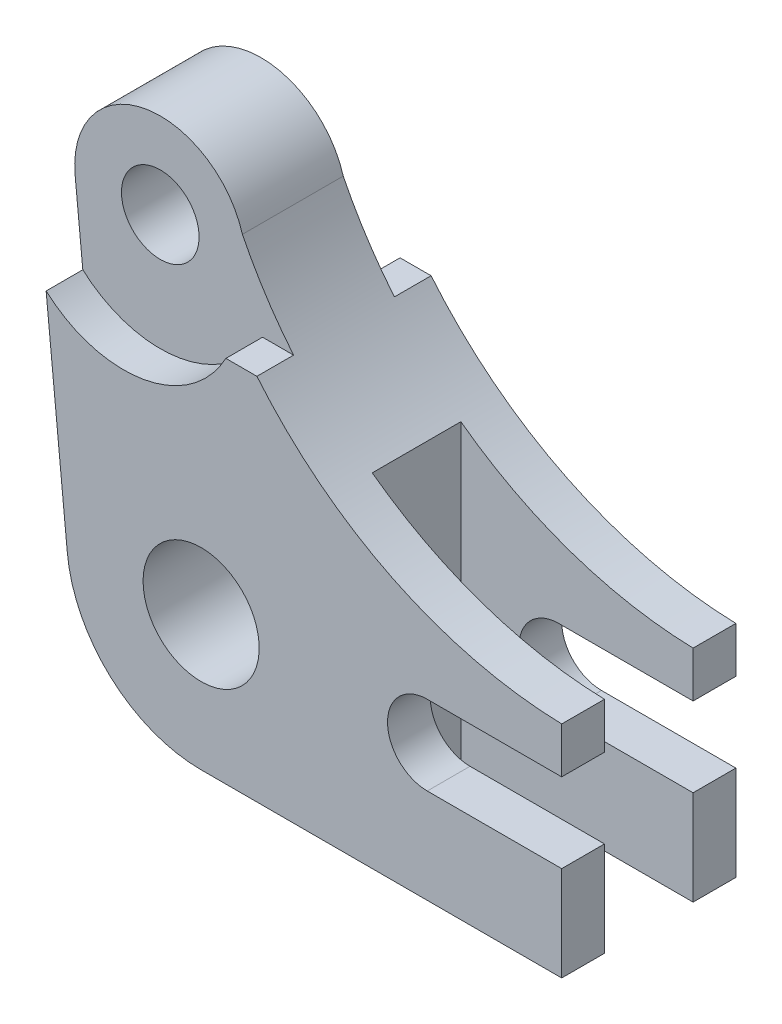
ISO-10303-21;
HEADER;
FILE_DESCRIPTION(('STEP AP214'),'2;1');
FILE_NAME('part.step','',(''),(''),'','','');
FILE_SCHEMA(('AUTOMOTIVE_DESIGN { 1 0 10303 214 1 1 1 1 }'));
ENDSEC;
DATA;
#1=APPLICATION_CONTEXT('core data for automotive mechanical design processes');
#2=APPLICATION_PROTOCOL_DEFINITION('international standard','automotive_design',2000,#1);
#3=PRODUCT_CONTEXT('',#1,'mechanical');
#4=PRODUCT('Part','Part','',(#3));
#5=PRODUCT_RELATED_PRODUCT_CATEGORY('part','',(#4));
#6=PRODUCT_DEFINITION_FORMATION('','',#4);
#7=PRODUCT_DEFINITION_CONTEXT('part definition',#1,'design');
#8=PRODUCT_DEFINITION('design','',#6,#7);
#9=PRODUCT_DEFINITION_SHAPE('','',#8);
#10=(LENGTH_UNIT() NAMED_UNIT(*) SI_UNIT(.MILLI.,.METRE.));
#11=(NAMED_UNIT(*) PLANE_ANGLE_UNIT() SI_UNIT($,.RADIAN.));
#12=(NAMED_UNIT(*) SI_UNIT($,.STERADIAN.) SOLID_ANGLE_UNIT());
#13=UNCERTAINTY_MEASURE_WITH_UNIT(LENGTH_MEASURE(1.E-05),#10,'distance_accuracy_value','');
#14=(GEOMETRIC_REPRESENTATION_CONTEXT(3) GLOBAL_UNCERTAINTY_ASSIGNED_CONTEXT((#13)) GLOBAL_UNIT_ASSIGNED_CONTEXT((#10,
#11,#12)) REPRESENTATION_CONTEXT('',''));
#15=CARTESIAN_POINT('',(0.,0.,0.));
#16=DIRECTION('',(0.,0.,1.));
#17=DIRECTION('',(1.,0.,0.));
#18=AXIS2_PLACEMENT_3D('',#15,#16,#17);
#19=CARTESIAN_POINT('',(-1.01804761617024,-59.4564208831454,28.5));
#20=DIRECTION('',(-1.,0.,0.));
#21=DIRECTION('',(0.,0.,1.));
#22=AXIS2_PLACEMENT_3D('',#19,#20,#21);
#23=PLANE('',#22);
#24=DIRECTION('',(0.,0.,-1.));
#25=VECTOR('',#24,1.);
#26=CARTESIAN_POINT('',(-1.01804761617024,-74.9564208831454,28.5));
#27=LINE('',#26,#25);
#28=CARTESIAN_POINT('',(-1.01804761617024,-74.9564208831454,28.5));
#29=VERTEX_POINT('',#28);
#30=CARTESIAN_POINT('',(-1.01804761617024,-74.9564208831454,21.5));
#31=VERTEX_POINT('',#30);
#32=EDGE_CURVE('E450',#29,#31,#27,.T.);
#33=ORIENTED_EDGE('',*,*,#32,.T.);
#34=DIRECTION('',(0.,-1.,0.));
#35=VECTOR('',#34,1.);
#36=CARTESIAN_POINT('',(-1.01804761617022,8.37394460501897,21.5));
#37=LINE('',#36,#35);
#38=CARTESIAN_POINT('',(-1.01804761617023,-59.4564208831454,21.5));
#39=VERTEX_POINT('',#38);
#40=EDGE_CURVE('E221',#39,#31,#37,.T.);
#41=ORIENTED_EDGE('',*,*,#40,.F.);
#42=DIRECTION('',(0.,0.,-1.));
#43=VECTOR('',#42,1.);
#44=CARTESIAN_POINT('',(-1.01804761617024,-59.4564208831454,28.5));
#45=LINE('',#44,#43);
#46=CARTESIAN_POINT('',(-1.01804761617024,-59.4564208831454,28.5));
#47=VERTEX_POINT('',#46);
#48=EDGE_CURVE('E445',#47,#39,#45,.T.);
#49=ORIENTED_EDGE('',*,*,#48,.F.);
#50=DIRECTION('',(0.,1.,0.));
#51=VECTOR('',#50,1.);
#52=CARTESIAN_POINT('',(-1.01804761617024,-59.4564208831454,28.5));
#53=LINE('',#52,#51);
#54=EDGE_CURVE('E357',#29,#47,#53,.T.);
#55=ORIENTED_EDGE('',*,*,#54,.F.);
#56=EDGE_LOOP('',(#33,#41,#49,#55));
#57=FACE_BOUND('',#56,.T.);
#58=ADVANCED_FACE('F44',(#57),#23,.F.);
#59=CARTESIAN_POINT('',(-23.0180476161702,-59.4564208831454,28.5));
#60=DIRECTION('',(0.,-1.,0.));
#61=DIRECTION('',(1.,0.,0.));
#62=AXIS2_PLACEMENT_3D('',#59,#60,#61);
#63=PLANE('',#62);
#64=ORIENTED_EDGE('',*,*,#48,.T.);
#65=DIRECTION('',(-1.,0.,0.));
#66=VECTOR('',#65,1.);
#67=CARTESIAN_POINT('',(-23.0180476161702,-59.4564208831454,21.5));
#68=LINE('',#67,#66);
#69=CARTESIAN_POINT('',(-23.0180476161702,-59.4564208831454,21.5));
#70=VERTEX_POINT('',#69);
#71=EDGE_CURVE('E264',#39,#70,#68,.T.);
#72=ORIENTED_EDGE('',*,*,#71,.T.);
#73=DIRECTION('',(0.,0.,-1.));
#74=VECTOR('',#73,1.);
#75=CARTESIAN_POINT('',(-23.0180476161702,-59.4564208831454,28.5));
#76=LINE('',#75,#74);
#77=CARTESIAN_POINT('',(-23.0180476161702,-59.4564208831454,28.5));
#78=VERTEX_POINT('',#77);
#79=EDGE_CURVE('E440',#78,#70,#76,.T.);
#80=ORIENTED_EDGE('',*,*,#79,.F.);
#81=DIRECTION('',(-1.,0.,0.));
#82=VECTOR('',#81,1.);
#83=CARTESIAN_POINT('',(-23.0180476161702,-59.4564208831454,28.5));
#84=LINE('',#83,#82);
#85=EDGE_CURVE('E360',#47,#78,#84,.T.);
#86=ORIENTED_EDGE('',*,*,#85,.F.);
#87=EDGE_LOOP('',(#64,#72,#80,#86));
#88=FACE_BOUND('',#87,.T.);
#89=ADVANCED_FACE('F498',(#88),#63,.F.);
#90=CARTESIAN_POINT('',(-23.0180476161702,-52.9564208831454,28.5));
#91=DIRECTION('',(0.,0.,-1.));
#92=DIRECTION('',(-1.,0.,0.));
#93=AXIS2_PLACEMENT_3D('',#90,#91,#92);
#94=CYLINDRICAL_SURFACE('',#93,6.5);
#95=ORIENTED_EDGE('',*,*,#79,.T.);
#96=CARTESIAN_POINT('',(-23.0180476161702,-52.9564208831454,21.5));
#97=DIRECTION('',(0.,0.,1.));
#98=DIRECTION('',(1.,0.,0.));
#99=AXIS2_PLACEMENT_3D('',#96,#97,#98);
#100=CIRCLE('',#99,6.5);
#101=CARTESIAN_POINT('',(-23.0180476161702,-46.4564208831454,21.5));
#102=VERTEX_POINT('',#101);
#103=EDGE_CURVE('E260',#70,#102,#100,.F.);
#104=ORIENTED_EDGE('',*,*,#103,.T.);
#105=DIRECTION('',(0.,0.,-1.));
#106=VECTOR('',#105,1.);
#107=CARTESIAN_POINT('',(-23.0180476161702,-46.4564208831454,28.5));
#108=LINE('',#107,#106);
#109=CARTESIAN_POINT('',(-23.0180476161702,-46.4564208831454,28.5));
#110=VERTEX_POINT('',#109);
#111=EDGE_CURVE('E435',#110,#102,#108,.T.);
#112=ORIENTED_EDGE('',*,*,#111,.F.);
#113=CARTESIAN_POINT('',(-23.0180476161702,-52.9564208831454,28.5));
#114=DIRECTION('',(0.,0.,-1.));
#115=DIRECTION('',(-1.,0.,0.));
#116=AXIS2_PLACEMENT_3D('',#113,#114,#115);
#117=CIRCLE('',#116,6.5);
#118=EDGE_CURVE('E363',#78,#110,#117,.T.);
#119=ORIENTED_EDGE('',*,*,#118,.F.);
#120=EDGE_LOOP('',(#95,#104,#112,#119));
#121=FACE_BOUND('',#120,.T.);
#122=ADVANCED_FACE('F496',(#121),#94,.F.);
#123=CARTESIAN_POINT('',(-1.01804761617024,-46.4564208831454,28.5));
#124=DIRECTION('',(0.,1.,0.));
#125=DIRECTION('',(-1.,0.,0.));
#126=AXIS2_PLACEMENT_3D('',#123,#124,#125);
#127=PLANE('',#126);
#128=ORIENTED_EDGE('',*,*,#111,.T.);
#129=DIRECTION('',(1.,0.,0.));
#130=VECTOR('',#129,1.);
#131=CARTESIAN_POINT('',(-1.01804761617024,-46.4564208831454,21.5));
#132=LINE('',#131,#130);
#133=CARTESIAN_POINT('',(-1.01804761617023,-46.4564208831454,21.5));
#134=VERTEX_POINT('',#133);
#135=EDGE_CURVE('E256',#102,#134,#132,.T.);
#136=ORIENTED_EDGE('',*,*,#135,.T.);
#137=DIRECTION('',(0.,0.,-1.));
#138=VECTOR('',#137,1.);
#139=CARTESIAN_POINT('',(-1.01804761617024,-46.4564208831454,28.5));
#140=LINE('',#139,#138);
#141=CARTESIAN_POINT('',(-1.01804761617024,-46.4564208831454,28.5));
#142=VERTEX_POINT('',#141);
#143=EDGE_CURVE('E430',#142,#134,#140,.T.);
#144=ORIENTED_EDGE('',*,*,#143,.F.);
#145=DIRECTION('',(1.,0.,0.));
#146=VECTOR('',#145,1.);
#147=CARTESIAN_POINT('',(-1.01804761617024,-46.4564208831454,28.5));
#148=LINE('',#147,#146);
#149=EDGE_CURVE('E366',#110,#142,#148,.T.);
#150=ORIENTED_EDGE('',*,*,#149,.F.);
#151=EDGE_LOOP('',(#128,#136,#144,#150));
#152=FACE_BOUND('',#151,.T.);
#153=ADVANCED_FACE('F482',(#152),#127,.F.);
#154=CARTESIAN_POINT('',(-1.01804761617024,-46.4564208831454,28.5));
#155=DIRECTION('',(-1.,0.,0.));
#156=DIRECTION('',(0.,0.,1.));
#157=AXIS2_PLACEMENT_3D('',#154,#155,#156);
#158=PLANE('',#157);
#159=ORIENTED_EDGE('',*,*,#143,.T.);
#160=CARTESIAN_POINT('',(-1.01804761617023,-38.9564208831453,21.5));
#161=VERTEX_POINT('',#160);
#162=EDGE_CURVE('E236',#161,#134,#37,.T.);
#163=ORIENTED_EDGE('',*,*,#162,.F.);
#164=DIRECTION('',(0.,0.,-1.));
#165=VECTOR('',#164,1.);
#166=CARTESIAN_POINT('',(-1.01804761617022,-38.9564208831454,28.5));
#167=LINE('',#166,#165);
#168=CARTESIAN_POINT('',(-1.01804761617022,-38.9564208831454,28.5));
#169=VERTEX_POINT('',#168);
#170=EDGE_CURVE('E425',#169,#161,#167,.T.);
#171=ORIENTED_EDGE('',*,*,#170,.F.);
#172=DIRECTION('',(0.,1.,0.));
#173=VECTOR('',#172,1.);
#174=CARTESIAN_POINT('',(-1.01804761617024,-46.4564208831454,28.5));
#175=LINE('',#174,#173);
#176=EDGE_CURVE('E369',#142,#169,#175,.T.);
#177=ORIENTED_EDGE('',*,*,#176,.F.);
#178=EDGE_LOOP('',(#159,#163,#171,#177));
#179=FACE_BOUND('',#178,.T.);
#180=ADVANCED_FACE('F486',(#179),#158,.F.);
#181=CARTESIAN_POINT('',(-72.7001808261938,-5.62605539498104,28.5));
#182=DIRECTION('',(0.,0.,-1.));
#183=DIRECTION('',(-1.,0.,0.));
#184=AXIS2_PLACEMENT_3D('',#181,#182,#183);
#185=CYLINDRICAL_SURFACE('',#184,14.);
#186=CARTESIAN_POINT('',(-72.7001808261938,-5.62605539498104,6.));
#187=DIRECTION('',(0.,0.,-1.));
#188=DIRECTION('',(-1.,0.,0.));
#189=AXIS2_PLACEMENT_3D('',#186,#187,#188);
#190=CIRCLE('',#189,14.);
#191=CARTESIAN_POINT('',(-86.6332804061776,-6.99307262027707,6.));
#192=VERTEX_POINT('',#191);
#193=CARTESIAN_POINT('',(-59.2631461078246,-1.69590298351638,6.));
#194=VERTEX_POINT('',#193);
#195=EDGE_CURVE('E282',#192,#194,#190,.T.);
#196=ORIENTED_EDGE('',*,*,#195,.F.);
#197=DIRECTION('',(0.,0.,-1.));
#198=VECTOR('',#197,1.);
#199=CARTESIAN_POINT('',(-86.6332804061776,-6.99307262027707,28.5));
#200=LINE('',#199,#198);
#201=CARTESIAN_POINT('',(-86.6332804061776,-6.99307262027707,22.5));
#202=VERTEX_POINT('',#201);
#203=EDGE_CURVE('E416',#202,#192,#200,.T.);
#204=ORIENTED_EDGE('',*,*,#203,.F.);
#205=CARTESIAN_POINT('',(-72.7001808261938,-5.62605539498104,22.5));
#206=DIRECTION('',(0.,0.,1.));
#207=DIRECTION('',(1.,0.,0.));
#208=AXIS2_PLACEMENT_3D('',#205,#206,#207);
#209=CIRCLE('',#208,14.);
#210=CARTESIAN_POINT('',(-59.2631461078246,-1.69590298351636,22.5));
#211=VERTEX_POINT('',#210);
#212=EDGE_CURVE('E308',#211,#202,#209,.T.);
#213=ORIENTED_EDGE('',*,*,#212,.F.);
#214=DIRECTION('',(0.,0.,-1.));
#215=VECTOR('',#214,1.);
#216=CARTESIAN_POINT('',(-59.2631461078246,-1.69590298351636,28.5));
#217=LINE('',#216,#215);
#218=EDGE_CURVE('E420',#211,#194,#217,.T.);
#219=ORIENTED_EDGE('',*,*,#218,.T.);
#220=EDGE_LOOP('',(#196,#204,#213,#219));
#221=FACE_BOUND('',#220,.T.);
#222=ADVANCED_FACE('F537',(#221),#185,.T.);
#223=CARTESIAN_POINT('',(-72.700180587229,-5.62605533095061,28.5));
#224=DIRECTION('',(0.,0.,-1.));
#225=DIRECTION('',(-1.,0.,0.));
#226=AXIS2_PLACEMENT_3D('',#223,#224,#225);
#227=CYLINDRICAL_SURFACE('',#226,6.34999999998991);
#228=CARTESIAN_POINT('',(-72.700180587229,-5.62605533095061,22.5));
#229=DIRECTION('',(0.,0.,1.));
#230=DIRECTION('',(1.,0.,0.));
#231=AXIS2_PLACEMENT_3D('',#228,#229,#230);
#232=CIRCLE('',#231,6.34999999998991);
#233=CARTESIAN_POINT('',(-79.0501805872189,-5.62605533095061,22.5));
#234=VERTEX_POINT('',#233);
#235=EDGE_CURVE('E334',#234,#234,#232,.T.);
#236=CARTESIAN_POINT('',(-72.700180587229,-5.62605533095061,6.));
#237=DIRECTION('',(0.,0.,-1.));
#238=DIRECTION('',(-1.,0.,0.));
#239=AXIS2_PLACEMENT_3D('',#236,#237,#238);
#240=CIRCLE('',#239,6.34999999998991);
#241=CARTESIAN_POINT('',(-79.0501805872189,-5.62605533095061,6.00000000000001));
#242=VERTEX_POINT('',#241);
#243=EDGE_CURVE('E295',#242,#242,#240,.T.);
#244=CARTESIAN_POINT('',(-79.0501805872189,-5.62605533095061,22.5));
#245=CARTESIAN_POINT('',(-79.0501805872189,-5.62605533095061,22.328125));
#246=CARTESIAN_POINT('',(-79.0501805872189,-5.62605533095061,22.15625));
#247=CARTESIAN_POINT('',(-79.0501805872189,-5.62605533095061,21.8125));
#248=CARTESIAN_POINT('',(-79.0501805872189,-5.62605533095061,21.640625));
#249=CARTESIAN_POINT('',(-79.0501805872189,-5.62605533095061,21.296875));
#250=CARTESIAN_POINT('',(-79.0501805872189,-5.62605533095061,21.125));
#251=CARTESIAN_POINT('',(-79.0501805872189,-5.62605533095061,20.78125));
#252=CARTESIAN_POINT('',(-79.0501805872189,-5.62605533095061,20.609375));
#253=CARTESIAN_POINT('',(-79.0501805872189,-5.62605533095061,20.265625));
#254=CARTESIAN_POINT('',(-79.0501805872189,-5.62605533095061,20.09375));
#255=CARTESIAN_POINT('',(-79.0501805872189,-5.62605533095061,19.75));
#256=CARTESIAN_POINT('',(-79.0501805872189,-5.62605533095061,19.578125));
#257=CARTESIAN_POINT('',(-79.0501805872189,-5.62605533095061,19.234375));
#258=CARTESIAN_POINT('',(-79.0501805872189,-5.62605533095061,19.0625));
#259=CARTESIAN_POINT('',(-79.0501805872189,-5.62605533095061,18.71875));
#260=CARTESIAN_POINT('',(-79.0501805872189,-5.62605533095061,18.546875));
#261=CARTESIAN_POINT('',(-79.0501805872189,-5.62605533095061,18.203125));
#262=CARTESIAN_POINT('',(-79.0501805872189,-5.62605533095061,18.03125));
#263=CARTESIAN_POINT('',(-79.0501805872189,-5.62605533095061,17.6875));
#264=CARTESIAN_POINT('',(-79.0501805872189,-5.62605533095061,17.515625));
#265=CARTESIAN_POINT('',(-79.0501805872189,-5.62605533095061,17.171875));
#266=CARTESIAN_POINT('',(-79.0501805872189,-5.62605533095061,17.));
#267=CARTESIAN_POINT('',(-79.0501805872189,-5.62605533095061,16.65625));
#268=CARTESIAN_POINT('',(-79.0501805872189,-5.62605533095061,16.484375));
#269=CARTESIAN_POINT('',(-79.0501805872189,-5.62605533095061,16.140625));
#270=CARTESIAN_POINT('',(-79.0501805872189,-5.62605533095061,15.96875));
#271=CARTESIAN_POINT('',(-79.0501805872189,-5.62605533095061,15.625));
#272=CARTESIAN_POINT('',(-79.0501805872189,-5.62605533095061,15.453125));
#273=CARTESIAN_POINT('',(-79.0501805872189,-5.62605533095061,15.109375));
#274=CARTESIAN_POINT('',(-79.0501805872189,-5.62605533095061,14.9375));
#275=CARTESIAN_POINT('',(-79.0501805872189,-5.62605533095061,14.59375));
#276=CARTESIAN_POINT('',(-79.0501805872189,-5.62605533095061,14.421875));
#277=CARTESIAN_POINT('',(-79.0501805872189,-5.62605533095061,14.078125));
#278=CARTESIAN_POINT('',(-79.0501805872189,-5.62605533095061,13.90625));
#279=CARTESIAN_POINT('',(-79.0501805872189,-5.62605533095061,13.5625));
#280=CARTESIAN_POINT('',(-79.0501805872189,-5.62605533095061,13.390625));
#281=CARTESIAN_POINT('',(-79.0501805872189,-5.62605533095061,13.046875));
#282=CARTESIAN_POINT('',(-79.0501805872189,-5.62605533095061,12.875));
#283=CARTESIAN_POINT('',(-79.0501805872189,-5.62605533095061,12.53125));
#284=CARTESIAN_POINT('',(-79.0501805872189,-5.62605533095061,12.359375));
#285=CARTESIAN_POINT('',(-79.0501805872189,-5.62605533095061,12.015625));
#286=CARTESIAN_POINT('',(-79.0501805872189,-5.62605533095061,11.84375));
#287=CARTESIAN_POINT('',(-79.0501805872189,-5.62605533095061,11.5));
#288=CARTESIAN_POINT('',(-79.0501805872189,-5.62605533095061,11.328125));
#289=CARTESIAN_POINT('',(-79.0501805872189,-5.62605533095061,10.984375));
#290=CARTESIAN_POINT('',(-79.0501805872189,-5.62605533095061,10.8125));
#291=CARTESIAN_POINT('',(-79.0501805872189,-5.62605533095061,10.46875));
#292=CARTESIAN_POINT('',(-79.0501805872189,-5.62605533095061,10.296875));
#293=CARTESIAN_POINT('',(-79.0501805872189,-5.62605533095061,9.953125));
#294=CARTESIAN_POINT('',(-79.0501805872189,-5.62605533095061,9.78125));
#295=CARTESIAN_POINT('',(-79.0501805872189,-5.62605533095061,9.4375));
#296=CARTESIAN_POINT('',(-79.0501805872189,-5.62605533095061,9.26562500000001));
#297=CARTESIAN_POINT('',(-79.0501805872189,-5.62605533095061,8.92187500000001));
#298=CARTESIAN_POINT('',(-79.0501805872189,-5.62605533095061,8.75000000000001));
#299=CARTESIAN_POINT('',(-79.0501805872189,-5.62605533095061,8.40625000000001));
#300=CARTESIAN_POINT('',(-79.0501805872189,-5.62605533095061,8.234375));
#301=CARTESIAN_POINT('',(-79.0501805872189,-5.62605533095061,7.890625));
#302=CARTESIAN_POINT('',(-79.0501805872189,-5.62605533095061,7.71875));
#303=CARTESIAN_POINT('',(-79.0501805872189,-5.62605533095061,7.375));
#304=CARTESIAN_POINT('',(-79.0501805872189,-5.62605533095061,7.203125));
#305=CARTESIAN_POINT('',(-79.0501805872189,-5.62605533095061,6.859375));
#306=CARTESIAN_POINT('',(-79.0501805872189,-5.62605533095061,6.6875));
#307=CARTESIAN_POINT('',(-79.0501805872189,-5.62605533095061,6.34375));
#308=CARTESIAN_POINT('',(-79.0501805872189,-5.62605533095061,6.17187500000001));
#309=CARTESIAN_POINT('',(-79.0501805872189,-5.62605533095061,6.00000000000001));
#310=B_SPLINE_CURVE_WITH_KNOTS('',3,(#244,#245,#246,#247,#248,#249,#250,#251,#252,#253,#254,
#255,#256,#257,#258,#259,#260,#261,#262,#263,#264,#265,#266,#267,#268,#269,#270,#271,#272,#273,
#274,#275,#276,#277,#278,#279,#280,#281,#282,#283,#284,#285,#286,#287,#288,#289,#290,#291,#292,
#293,#294,#295,#296,#297,#298,#299,#300,#301,#302,#303,#304,#305,#306,#307,#308,#309),
.UNSPECIFIED.,.F.,.F.,(4,2,2,2,2,2,2,2,2,2,2,2,2,2,2,2,2,2,2,2,2,2,2,2,2,2,2,2,2,2,2,2,4),(0.,
0.515624999999999,1.03125,1.546875,2.0625,2.578125,3.09375,3.60937499999999,4.125,4.640625,
5.15625,5.671875,6.18749999999999,6.70312499999999,7.21875,7.734375,8.24999999999999,8.765625,
9.28124999999999,9.79687499999999,10.3125,10.828125,11.34375,11.859375,12.375,12.890625,
13.40625,13.921875,14.4375,14.953125,15.46875,15.984375,16.5),.UNSPECIFIED.);
#311=EDGE_CURVE('BSEAM604',#234,#242,#310,.T.);
#312=ORIENTED_EDGE('',*,*,#235,.T.);
#313=ORIENTED_EDGE('',*,*,#243,.T.);
#314=ORIENTED_EDGE('',*,*,#311,.T.);
#315=ORIENTED_EDGE('',*,*,#311,.F.);
#316=EDGE_LOOP('',(#312,#314,#313,#315));
#317=FACE_BOUND('',#316,.T.);
#318=ADVANCED_FACE('F604',(#317),#227,.F.);
#319=CARTESIAN_POINT('',(-60.0180476161702,-52.9564208831454,28.5));
#320=DIRECTION('',(0.,0.,1.));
#321=DIRECTION('',(1.,0.,0.));
#322=AXIS2_PLACEMENT_3D('',#319,#320,#321);
#323=PLANE('',#322);
#324=DIRECTION('',(1.,0.,0.));
#325=VECTOR('',#324,1.);
#326=CARTESIAN_POINT('',(-50.8887818236801,-14.626055394981,28.5));
#327=LINE('',#326,#325);
#328=CARTESIAN_POINT('',(-55.9669802955123,-14.626055394981,28.5));
#329=VERTEX_POINT('',#328);
#330=CARTESIAN_POINT('',(-50.8887818236801,-14.626055394981,28.5));
#331=VERTEX_POINT('',#330);
#332=EDGE_CURVE('E309',#329,#331,#327,.T.);
#333=ORIENTED_EDGE('',*,*,#332,.F.);
#334=CARTESIAN_POINT('',(-72.7001808261938,-5.62605539498104,28.5));
#335=DIRECTION('',(0.,0.,1.));
#336=DIRECTION('',(-1.,0.,0.));
#337=AXIS2_PLACEMENT_3D('',#334,#335,#336);
#338=CIRCLE('',#337,19.);
#339=CARTESIAN_POINT('',(-85.3790193920369,-19.7769229521766,28.5));
#340=VERTEX_POINT('',#339);
#341=EDGE_CURVE('E304',#340,#329,#338,.T.);
#342=ORIENTED_EDGE('',*,*,#341,.F.);
#343=DIRECTION('',(0.0976440875211458,-0.995221398570269,0.));
#344=VECTOR('',#343,1.);
#345=CARTESIAN_POINT('',(-86.6332804061776,-6.99307262027707,28.5));
#346=LINE('',#345,#344);
#347=CARTESIAN_POINT('',(-81.9129183847161,-55.1045908086106,28.5));
#348=VERTEX_POINT('',#347);
#349=EDGE_CURVE('E376',#340,#348,#346,.T.);
#350=ORIENTED_EDGE('',*,*,#349,.T.);
#351=CARTESIAN_POINT('',(-60.0180476161702,-52.9564208831454,28.5));
#352=DIRECTION('',(0.,0.,1.));
#353=DIRECTION('',(1.,0.,0.));
#354=AXIS2_PLACEMENT_3D('',#351,#352,#353);
#355=CIRCLE('',#354,22.);
#356=CARTESIAN_POINT('',(-60.0180476161702,-74.9564208831454,28.5));
#357=VERTEX_POINT('',#356);
#358=EDGE_CURVE('E349',#348,#357,#355,.T.);
#359=ORIENTED_EDGE('',*,*,#358,.T.);
#360=DIRECTION('',(1.,0.,0.));
#361=VECTOR('',#360,1.);
#362=CARTESIAN_POINT('',(-1.01804761617024,-74.9564208831454,28.5));
#363=LINE('',#362,#361);
#364=EDGE_CURVE('E353',#357,#29,#363,.T.);
#365=ORIENTED_EDGE('',*,*,#364,.T.);
#366=ORIENTED_EDGE('',*,*,#54,.T.);
#367=ORIENTED_EDGE('',*,*,#85,.T.);
#368=ORIENTED_EDGE('',*,*,#118,.T.);
#369=ORIENTED_EDGE('',*,*,#149,.T.);
#370=ORIENTED_EDGE('',*,*,#176,.T.);
#371=CARTESIAN_POINT('',(0.786907620125597,28.0192622906377,28.5));
#372=DIRECTION('',(0.,0.,-1.));
#373=DIRECTION('',(-1.,0.,0.));
#374=AXIS2_PLACEMENT_3D('',#371,#372,#373);
#375=CIRCLE('',#374,67.);
#376=EDGE_CURVE('E372',#169,#331,#375,.T.);
#377=ORIENTED_EDGE('',*,*,#376,.T.);
#378=EDGE_LOOP('',(#333,#342,#350,#359,#365,#366,#367,#368,#369,#370,#377));
#379=FACE_BOUND('',#378,.T.);
#380=CARTESIAN_POINT('',(-60.0180476161702,-52.9564208831454,28.5));
#381=DIRECTION('',(0.,0.,1.));
#382=DIRECTION('',(1.,0.,0.));
#383=AXIS2_PLACEMENT_3D('',#380,#381,#382);
#384=CIRCLE('',#383,9.5);
#385=CARTESIAN_POINT('',(-69.5180476161702,-52.9564208831454,28.5));
#386=VERTEX_POINT('',#385);
#387=EDGE_CURVE('E340',#386,#386,#384,.T.);
#388=ORIENTED_EDGE('',*,*,#387,.F.);
#389=EDGE_LOOP('',(#388));
#390=FACE_BOUND('',#389,.T.);
#391=ADVANCED_FACE('F490',(#379,#390),#323,.T.);
#392=CARTESIAN_POINT('',(-60.0180476161702,-52.9564208831454,0.));
#393=DIRECTION('',(0.,0.,1.));
#394=DIRECTION('',(1.,0.,0.));
#395=AXIS2_PLACEMENT_3D('',#392,#393,#394);
#396=PLANE('',#395);
#397=DIRECTION('',(0.0976440875211458,-0.995221398570269,0.));
#398=VECTOR('',#397,1.);
#399=CARTESIAN_POINT('',(-86.6332804061776,-6.99307262027707,0.));
#400=LINE('',#399,#398);
#401=CARTESIAN_POINT('',(-85.3790193920369,-19.7769229521766,0.));
#402=VERTEX_POINT('',#401);
#403=CARTESIAN_POINT('',(-81.9129183847161,-55.1045908086106,0.));
#404=VERTEX_POINT('',#403);
#405=EDGE_CURVE('E354',#402,#404,#400,.T.);
#406=ORIENTED_EDGE('',*,*,#405,.F.);
#407=CARTESIAN_POINT('',(-72.7001808261938,-5.62605539498104,0.));
#408=DIRECTION('',(0.,0.,-1.));
#409=DIRECTION('',(-1.,0.,0.));
#410=AXIS2_PLACEMENT_3D('',#407,#408,#409);
#411=CIRCLE('',#410,19.);
#412=CARTESIAN_POINT('',(-55.9669802955123,-14.626055394981,0.));
#413=VERTEX_POINT('',#412);
#414=EDGE_CURVE('E274',#413,#402,#411,.T.);
#415=ORIENTED_EDGE('',*,*,#414,.F.);
#416=DIRECTION('',(-1.,0.,0.));
#417=VECTOR('',#416,1.);
#418=CARTESIAN_POINT('',(-50.8887818236801,-14.626055394981,0.));
#419=LINE('',#418,#417);
#420=CARTESIAN_POINT('',(-50.8887818236801,-14.626055394981,0.));
#421=VERTEX_POINT('',#420);
#422=EDGE_CURVE('E268',#421,#413,#419,.T.);
#423=ORIENTED_EDGE('',*,*,#422,.F.);
#424=CARTESIAN_POINT('',(0.786907620125597,28.0192622906377,0.));
#425=DIRECTION('',(0.,0.,-1.));
#426=DIRECTION('',(-1.,0.,0.));
#427=AXIS2_PLACEMENT_3D('',#424,#425,#426);
#428=CIRCLE('',#427,67.);
#429=CARTESIAN_POINT('',(-1.01804761617022,-38.9564208831454,0.));
#430=VERTEX_POINT('',#429);
#431=EDGE_CURVE('E407',#430,#421,#428,.T.);
#432=ORIENTED_EDGE('',*,*,#431,.F.);
#433=DIRECTION('',(0.,1.,0.));
#434=VECTOR('',#433,1.);
#435=CARTESIAN_POINT('',(-1.01804761617024,-46.4564208831454,0.));
#436=LINE('',#435,#434);
#437=CARTESIAN_POINT('',(-1.01804761617024,-46.4564208831454,0.));
#438=VERTEX_POINT('',#437);
#439=EDGE_CURVE('E403',#438,#430,#436,.T.);
#440=ORIENTED_EDGE('',*,*,#439,.F.);
#441=DIRECTION('',(1.,0.,0.));
#442=VECTOR('',#441,1.);
#443=CARTESIAN_POINT('',(-1.01804761617024,-46.4564208831454,0.));
#444=LINE('',#443,#442);
#445=CARTESIAN_POINT('',(-23.0180476161702,-46.4564208831454,0.));
#446=VERTEX_POINT('',#445);
#447=EDGE_CURVE('E399',#446,#438,#444,.T.);
#448=ORIENTED_EDGE('',*,*,#447,.F.);
#449=CARTESIAN_POINT('',(-23.0180476161702,-52.9564208831454,0.));
#450=DIRECTION('',(0.,0.,-1.));
#451=DIRECTION('',(-1.,0.,0.));
#452=AXIS2_PLACEMENT_3D('',#449,#450,#451);
#453=CIRCLE('',#452,6.5);
#454=CARTESIAN_POINT('',(-23.0180476161702,-59.4564208831454,0.));
#455=VERTEX_POINT('',#454);
#456=EDGE_CURVE('E395',#455,#446,#453,.T.);
#457=ORIENTED_EDGE('',*,*,#456,.F.);
#458=DIRECTION('',(-1.,0.,0.));
#459=VECTOR('',#458,1.);
#460=CARTESIAN_POINT('',(-23.0180476161702,-59.4564208831454,0.));
#461=LINE('',#460,#459);
#462=CARTESIAN_POINT('',(-1.01804761617024,-59.4564208831454,0.));
#463=VERTEX_POINT('',#462);
#464=EDGE_CURVE('E391',#463,#455,#461,.T.);
#465=ORIENTED_EDGE('',*,*,#464,.F.);
#466=DIRECTION('',(0.,1.,0.));
#467=VECTOR('',#466,1.);
#468=CARTESIAN_POINT('',(-1.01804761617024,-59.4564208831454,0.));
#469=LINE('',#468,#467);
#470=CARTESIAN_POINT('',(-1.01804761617024,-74.9564208831454,0.));
#471=VERTEX_POINT('',#470);
#472=EDGE_CURVE('E387',#471,#463,#469,.T.);
#473=ORIENTED_EDGE('',*,*,#472,.F.);
#474=DIRECTION('',(1.,0.,0.));
#475=VECTOR('',#474,1.);
#476=CARTESIAN_POINT('',(-1.01804761617024,-74.9564208831454,0.));
#477=LINE('',#476,#475);
#478=CARTESIAN_POINT('',(-60.0180476161702,-74.9564208831454,0.));
#479=VERTEX_POINT('',#478);
#480=EDGE_CURVE('E383',#479,#471,#477,.T.);
#481=ORIENTED_EDGE('',*,*,#480,.F.);
#482=CARTESIAN_POINT('',(-60.0180476161702,-52.9564208831454,0.));
#483=DIRECTION('',(0.,0.,1.));
#484=DIRECTION('',(1.,0.,0.));
#485=AXIS2_PLACEMENT_3D('',#482,#483,#484);
#486=CIRCLE('',#485,22.);
#487=EDGE_CURVE('E344',#404,#479,#486,.T.);
#488=ORIENTED_EDGE('',*,*,#487,.F.);
#489=EDGE_LOOP('',(#406,#415,#423,#432,#440,#448,#457,#465,#473,#481,#488));
#490=FACE_BOUND('',#489,.T.);
#491=CARTESIAN_POINT('',(-60.0180476161702,-52.9564208831454,0.));
#492=DIRECTION('',(0.,0.,1.));
#493=DIRECTION('',(1.,0.,0.));
#494=AXIS2_PLACEMENT_3D('',#491,#492,#493);
#495=CIRCLE('',#494,9.5);
#496=CARTESIAN_POINT('',(-69.5180476161702,-52.9564208831454,0.));
#497=VERTEX_POINT('',#496);
#498=EDGE_CURVE('E345',#497,#497,#495,.T.);
#499=ORIENTED_EDGE('',*,*,#498,.T.);
#500=EDGE_LOOP('',(#499));
#501=FACE_BOUND('',#500,.T.);
#502=ADVANCED_FACE('F511',(#490,#501),#396,.F.);
#503=CARTESIAN_POINT('',(-60.0180476161702,-52.9564208831454,28.5));
#504=DIRECTION('',(0.,0.,-1.));
#505=DIRECTION('',(-1.,0.,0.));
#506=AXIS2_PLACEMENT_3D('',#503,#504,#505);
#507=CYLINDRICAL_SURFACE('',#506,22.);
#508=ORIENTED_EDGE('',*,*,#487,.T.);
#509=DIRECTION('',(0.,0.,-1.));
#510=VECTOR('',#509,1.);
#511=CARTESIAN_POINT('',(-60.0180476161702,-74.9564208831454,28.5));
#512=LINE('',#511,#510);
#513=EDGE_CURVE('E453',#357,#479,#512,.T.);
#514=ORIENTED_EDGE('',*,*,#513,.F.);
#515=ORIENTED_EDGE('',*,*,#358,.F.);
#516=DIRECTION('',(0.,0.,-1.));
#517=VECTOR('',#516,1.);
#518=CARTESIAN_POINT('',(-81.9129183847161,-55.1045908086106,28.5));
#519=LINE('',#518,#517);
#520=EDGE_CURVE('E379',#348,#404,#519,.T.);
#521=ORIENTED_EDGE('',*,*,#520,.T.);
#522=EDGE_LOOP('',(#508,#514,#515,#521));
#523=FACE_BOUND('',#522,.T.);
#524=ADVANCED_FACE('F46',(#523),#507,.T.);
#525=CARTESIAN_POINT('',(-1.01804761617024,-74.9564208831454,28.5));
#526=DIRECTION('',(0.,1.,0.));
#527=DIRECTION('',(-1.,0.,0.));
#528=AXIS2_PLACEMENT_3D('',#525,#526,#527);
#529=PLANE('',#528);
#530=DIRECTION('',(0.,0.,-1.));
#531=VECTOR('',#530,1.);
#532=CARTESIAN_POINT('',(-39.0180476161702,-74.9564208831454,7.));
#533=LINE('',#532,#531);
#534=CARTESIAN_POINT('',(-39.0180476161702,-74.9564208831454,21.5));
#535=VERTEX_POINT('',#534);
#536=CARTESIAN_POINT('',(-39.0180476161702,-74.9564208831454,7.));
#537=VERTEX_POINT('',#536);
#538=EDGE_CURVE('E209',#535,#537,#533,.T.);
#539=ORIENTED_EDGE('',*,*,#538,.F.);
#540=DIRECTION('',(-1.,0.,0.));
#541=VECTOR('',#540,1.);
#542=CARTESIAN_POINT('',(-39.0180476161702,-74.9564208831454,21.5));
#543=LINE('',#542,#541);
#544=EDGE_CURVE('E218',#31,#535,#543,.T.);
#545=ORIENTED_EDGE('',*,*,#544,.F.);
#546=ORIENTED_EDGE('',*,*,#32,.F.);
#547=ORIENTED_EDGE('',*,*,#364,.F.);
#548=ORIENTED_EDGE('',*,*,#513,.T.);
#549=ORIENTED_EDGE('',*,*,#480,.T.);
#550=CARTESIAN_POINT('',(-1.01804761617024,-74.9564208831454,7.));
#551=VERTEX_POINT('',#550);
#552=EDGE_CURVE('E449',#551,#471,#27,.T.);
#553=ORIENTED_EDGE('',*,*,#552,.F.);
#554=DIRECTION('',(1.,0.,0.));
#555=VECTOR('',#554,1.);
#556=CARTESIAN_POINT('',(-39.0180476161702,-74.9564208831454,7.));
#557=LINE('',#556,#555);
#558=EDGE_CURVE('E215',#537,#551,#557,.T.);
#559=ORIENTED_EDGE('',*,*,#558,.F.);
#560=EDGE_LOOP('',(#539,#545,#546,#547,#548,#549,#553,#559));
#561=FACE_BOUND('',#560,.T.);
#562=ADVANCED_FACE('F227',(#561),#529,.F.);
#563=CARTESIAN_POINT('',(-1.01804761617023,-59.4564208831454,7.));
#564=VERTEX_POINT('',#563);
#565=EDGE_CURVE('E444',#564,#463,#45,.T.);
#566=ORIENTED_EDGE('',*,*,#565,.F.);
#567=DIRECTION('',(0.,-1.,0.));
#568=VECTOR('',#567,1.);
#569=CARTESIAN_POINT('',(-1.01804761617022,8.37394460501897,7.));
#570=LINE('',#569,#568);
#571=EDGE_CURVE('E238',#564,#551,#570,.T.);
#572=ORIENTED_EDGE('',*,*,#571,.T.);
#573=ORIENTED_EDGE('',*,*,#552,.T.);
#574=ORIENTED_EDGE('',*,*,#472,.T.);
#575=EDGE_LOOP('',(#566,#572,#573,#574));
#576=FACE_BOUND('',#575,.T.);
#577=ADVANCED_FACE('F566',(#576),#23,.F.);
#578=CARTESIAN_POINT('',(-23.0180476161702,-59.4564208831454,7.));
#579=VERTEX_POINT('',#578);
#580=EDGE_CURVE('E439',#579,#455,#76,.T.);
#581=ORIENTED_EDGE('',*,*,#580,.F.);
#582=DIRECTION('',(1.,0.,0.));
#583=VECTOR('',#582,1.);
#584=CARTESIAN_POINT('',(-23.0180476161702,-59.4564208831454,7.));
#585=LINE('',#584,#583);
#586=EDGE_CURVE('E252',#579,#564,#585,.T.);
#587=ORIENTED_EDGE('',*,*,#586,.T.);
#588=ORIENTED_EDGE('',*,*,#565,.T.);
#589=ORIENTED_EDGE('',*,*,#464,.T.);
#590=EDGE_LOOP('',(#581,#587,#588,#589));
#591=FACE_BOUND('',#590,.T.);
#592=ADVANCED_FACE('F572',(#591),#63,.F.);
#593=CARTESIAN_POINT('',(-23.0180476161702,-46.4564208831454,7.));
#594=VERTEX_POINT('',#593);
#595=EDGE_CURVE('E434',#594,#446,#108,.T.);
#596=ORIENTED_EDGE('',*,*,#595,.F.);
#597=CARTESIAN_POINT('',(-23.0180476161702,-52.9564208831454,7.));
#598=DIRECTION('',(0.,0.,-1.));
#599=DIRECTION('',(-1.,0.,0.));
#600=AXIS2_PLACEMENT_3D('',#597,#598,#599);
#601=CIRCLE('',#600,6.5);
#602=EDGE_CURVE('E248',#594,#579,#601,.F.);
#603=ORIENTED_EDGE('',*,*,#602,.T.);
#604=ORIENTED_EDGE('',*,*,#580,.T.);
#605=ORIENTED_EDGE('',*,*,#456,.T.);
#606=EDGE_LOOP('',(#596,#603,#604,#605));
#607=FACE_BOUND('',#606,.T.);
#608=ADVANCED_FACE('F578',(#607),#94,.F.);
#609=CARTESIAN_POINT('',(-1.01804761617023,-46.4564208831454,7.));
#610=VERTEX_POINT('',#609);
#611=EDGE_CURVE('E429',#610,#438,#140,.T.);
#612=ORIENTED_EDGE('',*,*,#611,.F.);
#613=DIRECTION('',(-1.,0.,0.));
#614=VECTOR('',#613,1.);
#615=CARTESIAN_POINT('',(-1.01804761617024,-46.4564208831454,7.));
#616=LINE('',#615,#614);
#617=EDGE_CURVE('E244',#610,#594,#616,.T.);
#618=ORIENTED_EDGE('',*,*,#617,.T.);
#619=ORIENTED_EDGE('',*,*,#595,.T.);
#620=ORIENTED_EDGE('',*,*,#447,.T.);
#621=EDGE_LOOP('',(#612,#618,#619,#620));
#622=FACE_BOUND('',#621,.T.);
#623=ADVANCED_FACE('F523',(#622),#127,.F.);
#624=CARTESIAN_POINT('',(-1.01804761617023,-38.9564208831454,7.));
#625=VERTEX_POINT('',#624);
#626=EDGE_CURVE('E424',#625,#430,#167,.T.);
#627=ORIENTED_EDGE('',*,*,#626,.F.);
#628=EDGE_CURVE('E237',#625,#610,#570,.T.);
#629=ORIENTED_EDGE('',*,*,#628,.T.);
#630=ORIENTED_EDGE('',*,*,#611,.T.);
#631=ORIENTED_EDGE('',*,*,#439,.T.);
#632=EDGE_LOOP('',(#627,#629,#630,#631));
#633=FACE_BOUND('',#632,.T.);
#634=ADVANCED_FACE('F469',(#633),#158,.F.);
#635=CARTESIAN_POINT('',(0.786907620125597,28.0192622906377,28.5));
#636=DIRECTION('',(0.,0.,-1.));
#637=DIRECTION('',(-1.,0.,0.));
#638=AXIS2_PLACEMENT_3D('',#635,#636,#637);
#639=CYLINDRICAL_SURFACE('',#638,67.);
#640=ORIENTED_EDGE('',*,*,#170,.T.);
#641=CARTESIAN_POINT('',(0.786907620125597,28.0192622906377,21.5));
#642=DIRECTION('',(0.,0.,1.));
#643=DIRECTION('',(1.,0.,0.));
#644=AXIS2_PLACEMENT_3D('',#641,#642,#643);
#645=CIRCLE('',#644,67.);
#646=CARTESIAN_POINT('',(-39.0180476161702,-25.8747590720003,21.5));
#647=VERTEX_POINT('',#646);
#648=EDGE_CURVE('E11',#161,#647,#645,.F.);
#649=ORIENTED_EDGE('',*,*,#648,.T.);
#650=DIRECTION('',(0.,0.,-1.));
#651=VECTOR('',#650,1.);
#652=CARTESIAN_POINT('',(-39.0180476161702,-25.8747590720003,28.5));
#653=LINE('',#652,#651);
#654=CARTESIAN_POINT('',(-39.0180476161702,-25.8747590720003,7.));
#655=VERTEX_POINT('',#654);
#656=EDGE_CURVE('E212',#647,#655,#653,.T.);
#657=ORIENTED_EDGE('',*,*,#656,.T.);
#658=CARTESIAN_POINT('',(0.786907620125597,28.0192622906377,7.));
#659=DIRECTION('',(0.,0.,-1.));
#660=DIRECTION('',(-1.,0.,0.));
#661=AXIS2_PLACEMENT_3D('',#658,#659,#660);
#662=CIRCLE('',#661,67.);
#663=EDGE_CURVE('E53',#655,#625,#662,.F.);
#664=ORIENTED_EDGE('',*,*,#663,.T.);
#665=ORIENTED_EDGE('',*,*,#626,.T.);
#666=ORIENTED_EDGE('',*,*,#431,.T.);
#667=DIRECTION('',(0.,0.,-1.));
#668=VECTOR('',#667,1.);
#669=CARTESIAN_POINT('',(-50.8887818236801,-14.626055394981,6.));
#670=LINE('',#669,#668);
#671=CARTESIAN_POINT('',(-50.8887818236801,-14.626055394981,6.));
#672=VERTEX_POINT('',#671);
#673=EDGE_CURVE('E285',#672,#421,#670,.T.);
#674=ORIENTED_EDGE('',*,*,#673,.F.);
#675=CARTESIAN_POINT('',(0.786907620125597,28.0192622906377,6.));
#676=DIRECTION('',(0.,0.,1.));
#677=DIRECTION('',(-1.,0.,0.));
#678=AXIS2_PLACEMENT_3D('',#675,#676,#677);
#679=CIRCLE('',#678,67.);
#680=EDGE_CURVE('E269',#194,#672,#679,.T.);
#681=ORIENTED_EDGE('',*,*,#680,.F.);
#682=ORIENTED_EDGE('',*,*,#218,.F.);
#683=CARTESIAN_POINT('',(0.786907620125597,28.0192622906377,22.5));
#684=DIRECTION('',(0.,0.,-1.));
#685=DIRECTION('',(1.,0.,0.));
#686=AXIS2_PLACEMENT_3D('',#683,#684,#685);
#687=CIRCLE('',#686,67.);
#688=CARTESIAN_POINT('',(-50.8887818236801,-14.626055394981,22.5));
#689=VERTEX_POINT('',#688);
#690=EDGE_CURVE('E305',#689,#211,#687,.T.);
#691=ORIENTED_EDGE('',*,*,#690,.F.);
#692=DIRECTION('',(0.,0.,1.));
#693=VECTOR('',#692,1.);
#694=CARTESIAN_POINT('',(-50.8887818236801,-14.626055394981,22.5));
#695=LINE('',#694,#693);
#696=EDGE_CURVE('E330',#689,#331,#695,.T.);
#697=ORIENTED_EDGE('',*,*,#696,.T.);
#698=ORIENTED_EDGE('',*,*,#376,.F.);
#699=EDGE_LOOP('',(#640,#649,#657,#664,#665,#666,#674,#681,#682,#691,#697,#698));
#700=FACE_BOUND('',#699,.T.);
#701=ADVANCED_FACE('F465',(#700),#639,.F.);
#702=CARTESIAN_POINT('',(-86.6332804061776,-6.99307262027707,28.5));
#703=DIRECTION('',(0.995221398570269,0.0976440875211458,0.));
#704=DIRECTION('',(-0.0976440875211458,0.995221398570269,0.));
#705=AXIS2_PLACEMENT_3D('',#702,#703,#704);
#706=PLANE('',#705);
#707=DIRECTION('',(-0.0976440875211469,0.995221398570269,0.));
#708=VECTOR('',#707,1.);
#709=CARTESIAN_POINT('',(-85.3790193920369,-19.7769229521766,6.));
#710=LINE('',#709,#708);
#711=CARTESIAN_POINT('',(-85.3790193920369,-19.7769229521766,6.));
#712=VERTEX_POINT('',#711);
#713=EDGE_CURVE('E279',#712,#192,#710,.T.);
#714=ORIENTED_EDGE('',*,*,#713,.F.);
#715=DIRECTION('',(0.,0.,-1.));
#716=VECTOR('',#715,1.);
#717=CARTESIAN_POINT('',(-85.3790193920369,-19.7769229521766,6.));
#718=LINE('',#717,#716);
#719=EDGE_CURVE('E291',#712,#402,#718,.T.);
#720=ORIENTED_EDGE('',*,*,#719,.T.);
#721=ORIENTED_EDGE('',*,*,#405,.T.);
#722=ORIENTED_EDGE('',*,*,#520,.F.);
#723=ORIENTED_EDGE('',*,*,#349,.F.);
#724=DIRECTION('',(0.,0.,1.));
#725=VECTOR('',#724,1.);
#726=CARTESIAN_POINT('',(-85.3790193920369,-19.7769229521766,22.5));
#727=LINE('',#726,#725);
#728=CARTESIAN_POINT('',(-85.3790193920369,-19.7769229521766,22.5));
#729=VERTEX_POINT('',#728);
#730=EDGE_CURVE('E324',#729,#340,#727,.T.);
#731=ORIENTED_EDGE('',*,*,#730,.F.);
#732=DIRECTION('',(0.0976440875211469,-0.995221398570269,0.));
#733=VECTOR('',#732,1.);
#734=CARTESIAN_POINT('',(-86.6332804061776,-6.99307262027707,22.5));
#735=LINE('',#734,#733);
#736=EDGE_CURVE('E312',#202,#729,#735,.T.);
#737=ORIENTED_EDGE('',*,*,#736,.F.);
#738=ORIENTED_EDGE('',*,*,#203,.T.);
#739=EDGE_LOOP('',(#714,#720,#721,#722,#723,#731,#737,#738));
#740=FACE_BOUND('',#739,.T.);
#741=ADVANCED_FACE('F541',(#740),#706,.F.);
#742=CARTESIAN_POINT('',(-60.0180476161702,-52.9564208831454,28.5));
#743=DIRECTION('',(0.,0.,-1.));
#744=DIRECTION('',(-1.,0.,0.));
#745=AXIS2_PLACEMENT_3D('',#742,#743,#744);
#746=CYLINDRICAL_SURFACE('',#745,9.5);
#747=CARTESIAN_POINT('',(-69.5180476161702,-52.9564208831454,28.5));
#748=CARTESIAN_POINT('',(-69.5180476161702,-52.9564208831454,28.203125));
#749=CARTESIAN_POINT('',(-69.5180476161702,-52.9564208831454,27.90625));
#750=CARTESIAN_POINT('',(-69.5180476161702,-52.9564208831454,27.3125));
#751=CARTESIAN_POINT('',(-69.5180476161702,-52.9564208831454,27.015625));
#752=CARTESIAN_POINT('',(-69.5180476161702,-52.9564208831454,26.421875));
#753=CARTESIAN_POINT('',(-69.5180476161702,-52.9564208831454,26.125));
#754=CARTESIAN_POINT('',(-69.5180476161702,-52.9564208831454,25.53125));
#755=CARTESIAN_POINT('',(-69.5180476161702,-52.9564208831454,25.234375));
#756=CARTESIAN_POINT('',(-69.5180476161702,-52.9564208831454,24.640625));
#757=CARTESIAN_POINT('',(-69.5180476161702,-52.9564208831454,24.34375));
#758=CARTESIAN_POINT('',(-69.5180476161702,-52.9564208831454,23.75));
#759=CARTESIAN_POINT('',(-69.5180476161702,-52.9564208831454,23.453125));
#760=CARTESIAN_POINT('',(-69.5180476161702,-52.9564208831454,22.859375));
#761=CARTESIAN_POINT('',(-69.5180476161702,-52.9564208831454,22.5625));
#762=CARTESIAN_POINT('',(-69.5180476161702,-52.9564208831454,21.96875));
#763=CARTESIAN_POINT('',(-69.5180476161702,-52.9564208831454,21.671875));
#764=CARTESIAN_POINT('',(-69.5180476161702,-52.9564208831454,21.078125));
#765=CARTESIAN_POINT('',(-69.5180476161702,-52.9564208831454,20.78125));
#766=CARTESIAN_POINT('',(-69.5180476161702,-52.9564208831454,20.1875));
#767=CARTESIAN_POINT('',(-69.5180476161702,-52.9564208831454,19.890625));
#768=CARTESIAN_POINT('',(-69.5180476161702,-52.9564208831454,19.296875));
#769=CARTESIAN_POINT('',(-69.5180476161702,-52.9564208831454,19.));
#770=CARTESIAN_POINT('',(-69.5180476161702,-52.9564208831454,18.40625));
#771=CARTESIAN_POINT('',(-69.5180476161702,-52.9564208831454,18.109375));
#772=CARTESIAN_POINT('',(-69.5180476161702,-52.9564208831454,17.515625));
#773=CARTESIAN_POINT('',(-69.5180476161702,-52.9564208831454,17.21875));
#774=CARTESIAN_POINT('',(-69.5180476161702,-52.9564208831454,16.625));
#775=CARTESIAN_POINT('',(-69.5180476161702,-52.9564208831454,16.328125));
#776=CARTESIAN_POINT('',(-69.5180476161702,-52.9564208831454,15.734375));
#777=CARTESIAN_POINT('',(-69.5180476161702,-52.9564208831454,15.4375));
#778=CARTESIAN_POINT('',(-69.5180476161702,-52.9564208831454,14.84375));
#779=CARTESIAN_POINT('',(-69.5180476161702,-52.9564208831454,14.546875));
#780=CARTESIAN_POINT('',(-69.5180476161702,-52.9564208831454,13.953125));
#781=CARTESIAN_POINT('',(-69.5180476161702,-52.9564208831454,13.65625));
#782=CARTESIAN_POINT('',(-69.5180476161702,-52.9564208831454,13.0625));
#783=CARTESIAN_POINT('',(-69.5180476161702,-52.9564208831454,12.765625));
#784=CARTESIAN_POINT('',(-69.5180476161702,-52.9564208831454,12.171875));
#785=CARTESIAN_POINT('',(-69.5180476161702,-52.9564208831454,11.875));
#786=CARTESIAN_POINT('',(-69.5180476161702,-52.9564208831454,11.28125));
#787=CARTESIAN_POINT('',(-69.5180476161702,-52.9564208831454,10.984375));
#788=CARTESIAN_POINT('',(-69.5180476161702,-52.9564208831454,10.390625));
#789=CARTESIAN_POINT('',(-69.5180476161702,-52.9564208831454,10.09375));
#790=CARTESIAN_POINT('',(-69.5180476161702,-52.9564208831454,9.5));
#791=CARTESIAN_POINT('',(-69.5180476161702,-52.9564208831454,9.203125));
#792=CARTESIAN_POINT('',(-69.5180476161702,-52.9564208831454,8.609375));
#793=CARTESIAN_POINT('',(-69.5180476161702,-52.9564208831454,8.3125));
#794=CARTESIAN_POINT('',(-69.5180476161702,-52.9564208831454,7.71875));
#795=CARTESIAN_POINT('',(-69.5180476161702,-52.9564208831454,7.421875));
#796=CARTESIAN_POINT('',(-69.5180476161702,-52.9564208831454,6.828125));
#797=CARTESIAN_POINT('',(-69.5180476161702,-52.9564208831454,6.53125));
#798=CARTESIAN_POINT('',(-69.5180476161702,-52.9564208831454,5.9375));
#799=CARTESIAN_POINT('',(-69.5180476161702,-52.9564208831454,5.640625));
#800=CARTESIAN_POINT('',(-69.5180476161702,-52.9564208831454,5.046875));
#801=CARTESIAN_POINT('',(-69.5180476161702,-52.9564208831454,4.75));
#802=CARTESIAN_POINT('',(-69.5180476161702,-52.9564208831454,4.15625));
#803=CARTESIAN_POINT('',(-69.5180476161702,-52.9564208831454,3.859375));
#804=CARTESIAN_POINT('',(-69.5180476161702,-52.9564208831454,3.265625));
#805=CARTESIAN_POINT('',(-69.5180476161702,-52.9564208831454,2.96875));
#806=CARTESIAN_POINT('',(-69.5180476161702,-52.9564208831454,2.375));
#807=CARTESIAN_POINT('',(-69.5180476161702,-52.9564208831454,2.078125));
#808=CARTESIAN_POINT('',(-69.5180476161702,-52.9564208831454,1.484375));
#809=CARTESIAN_POINT('',(-69.5180476161702,-52.9564208831454,1.1875));
#810=CARTESIAN_POINT('',(-69.5180476161702,-52.9564208831454,0.593749999999999));
#811=CARTESIAN_POINT('',(-69.5180476161702,-52.9564208831454,0.296875));
#812=CARTESIAN_POINT('',(-69.5180476161702,-52.9564208831454,0.));
#813=B_SPLINE_CURVE_WITH_KNOTS('',3,(#747,#748,#749,#750,#751,#752,#753,#754,#755,#756,#757,
#758,#759,#760,#761,#762,#763,#764,#765,#766,#767,#768,#769,#770,#771,#772,#773,#774,#775,#776,
#777,#778,#779,#780,#781,#782,#783,#784,#785,#786,#787,#788,#789,#790,#791,#792,#793,#794,#795,
#796,#797,#798,#799,#800,#801,#802,#803,#804,#805,#806,#807,#808,#809,#810,#811,#812),
.UNSPECIFIED.,.F.,.F.,(4,2,2,2,2,2,2,2,2,2,2,2,2,2,2,2,2,2,2,2,2,2,2,2,2,2,2,2,2,2,2,2,4),(0.,
0.890625000000003,1.78125,2.671875,3.5625,4.453125,5.34375,6.234375,7.125,8.015625,8.90625,
9.796875,10.6875,11.578125,12.46875,13.359375,14.25,15.140625,16.03125,16.921875,17.8125,
18.703125,19.59375,20.484375,21.375,22.265625,23.15625,24.046875,24.9375,25.828125,26.71875,
27.609375,28.5),.UNSPECIFIED.);
#814=EDGE_CURVE('BSEAM606',#386,#497,#813,.T.);
#815=ORIENTED_EDGE('',*,*,#387,.T.);
#816=ORIENTED_EDGE('',*,*,#498,.F.);
#817=ORIENTED_EDGE('',*,*,#814,.T.);
#818=ORIENTED_EDGE('',*,*,#814,.F.);
#819=EDGE_LOOP('',(#815,#817,#816,#818));
#820=FACE_BOUND('',#819,.T.);
#821=ADVANCED_FACE('F606',(#820),#746,.F.);
#822=CARTESIAN_POINT('',(-50.8887818236801,-14.626055394981,22.5));
#823=DIRECTION('',(0.,-1.,0.));
#824=DIRECTION('',(1.,0.,0.));
#825=AXIS2_PLACEMENT_3D('',#822,#823,#824);
#826=PLANE('',#825);
#827=ORIENTED_EDGE('',*,*,#332,.T.);
#828=ORIENTED_EDGE('',*,*,#696,.F.);
#829=DIRECTION('',(1.,0.,0.));
#830=VECTOR('',#829,1.);
#831=CARTESIAN_POINT('',(-50.8887818236801,-14.626055394981,22.5));
#832=LINE('',#831,#830);
#833=CARTESIAN_POINT('',(-55.9669802955123,-14.626055394981,22.5));
#834=VERTEX_POINT('',#833);
#835=EDGE_CURVE('E320',#834,#689,#832,.T.);
#836=ORIENTED_EDGE('',*,*,#835,.F.);
#837=DIRECTION('',(0.,0.,1.));
#838=VECTOR('',#837,1.);
#839=CARTESIAN_POINT('',(-55.9669802955123,-14.626055394981,22.5));
#840=LINE('',#839,#838);
#841=EDGE_CURVE('E335',#834,#329,#840,.T.);
#842=ORIENTED_EDGE('',*,*,#841,.T.);
#843=EDGE_LOOP('',(#827,#828,#836,#842));
#844=FACE_BOUND('',#843,.T.);
#845=ADVANCED_FACE('F548',(#844),#826,.F.);
#846=CARTESIAN_POINT('',(-72.7001808261938,-5.62605539498104,22.5));
#847=DIRECTION('',(0.,0.,1.));
#848=DIRECTION('',(1.,0.,0.));
#849=AXIS2_PLACEMENT_3D('',#846,#847,#848);
#850=CYLINDRICAL_SURFACE('',#849,19.);
#851=ORIENTED_EDGE('',*,*,#341,.T.);
#852=ORIENTED_EDGE('',*,*,#841,.F.);
#853=CARTESIAN_POINT('',(-72.7001808261938,-5.62605539498104,22.5));
#854=DIRECTION('',(0.,0.,1.));
#855=DIRECTION('',(-1.,0.,0.));
#856=AXIS2_PLACEMENT_3D('',#853,#854,#855);
#857=CIRCLE('',#856,19.);
#858=EDGE_CURVE('E316',#729,#834,#857,.T.);
#859=ORIENTED_EDGE('',*,*,#858,.F.);
#860=ORIENTED_EDGE('',*,*,#730,.T.);
#861=EDGE_LOOP('',(#851,#852,#859,#860));
#862=FACE_BOUND('',#861,.T.);
#863=ADVANCED_FACE('F560',(#862),#850,.F.);
#864=CARTESIAN_POINT('',(0.786907620125597,28.0192622906377,22.5));
#865=DIRECTION('',(0.,0.,1.));
#866=DIRECTION('',(1.,0.,0.));
#867=AXIS2_PLACEMENT_3D('',#864,#865,#866);
#868=PLANE('',#867);
#869=ORIENTED_EDGE('',*,*,#235,.F.);
#870=EDGE_LOOP('',(#869));
#871=FACE_BOUND('',#870,.T.);
#872=ORIENTED_EDGE('',*,*,#690,.T.);
#873=ORIENTED_EDGE('',*,*,#212,.T.);
#874=ORIENTED_EDGE('',*,*,#736,.T.);
#875=ORIENTED_EDGE('',*,*,#858,.T.);
#876=ORIENTED_EDGE('',*,*,#835,.T.);
#877=EDGE_LOOP('',(#872,#873,#874,#875,#876));
#878=FACE_BOUND('',#877,.T.);
#879=ADVANCED_FACE('F544',(#871,#878),#868,.T.);
#880=CARTESIAN_POINT('',(-72.7001808261938,-5.62605539498104,6.));
#881=DIRECTION('',(0.,0.,-1.));
#882=DIRECTION('',(-1.,0.,0.));
#883=AXIS2_PLACEMENT_3D('',#880,#881,#882);
#884=CYLINDRICAL_SURFACE('',#883,19.);
#885=ORIENTED_EDGE('',*,*,#414,.T.);
#886=ORIENTED_EDGE('',*,*,#719,.F.);
#887=CARTESIAN_POINT('',(-72.7001808261938,-5.62605539498104,6.));
#888=DIRECTION('',(0.,0.,-1.));
#889=DIRECTION('',(-1.,0.,0.));
#890=AXIS2_PLACEMENT_3D('',#887,#888,#889);
#891=CIRCLE('',#890,19.);
#892=CARTESIAN_POINT('',(-55.9669802955123,-14.626055394981,6.));
#893=VERTEX_POINT('',#892);
#894=EDGE_CURVE('E68',#893,#712,#891,.T.);
#895=ORIENTED_EDGE('',*,*,#894,.F.);
#896=DIRECTION('',(0.,0.,-1.));
#897=VECTOR('',#896,1.);
#898=CARTESIAN_POINT('',(-55.9669802955123,-14.626055394981,6.));
#899=LINE('',#898,#897);
#900=EDGE_CURVE('E296',#893,#413,#899,.T.);
#901=ORIENTED_EDGE('',*,*,#900,.T.);
#902=EDGE_LOOP('',(#885,#886,#895,#901));
#903=FACE_BOUND('',#902,.T.);
#904=ADVANCED_FACE('F551',(#903),#884,.F.);
#905=CARTESIAN_POINT('',(-50.8887818236801,-14.626055394981,6.));
#906=DIRECTION('',(0.,-1.,0.));
#907=DIRECTION('',(1.,0.,0.));
#908=AXIS2_PLACEMENT_3D('',#905,#906,#907);
#909=PLANE('',#908);
#910=ORIENTED_EDGE('',*,*,#422,.T.);
#911=ORIENTED_EDGE('',*,*,#900,.F.);
#912=DIRECTION('',(-1.,0.,0.));
#913=VECTOR('',#912,1.);
#914=CARTESIAN_POINT('',(-50.8887818236801,-14.626055394981,6.));
#915=LINE('',#914,#913);
#916=EDGE_CURVE('E273',#672,#893,#915,.T.);
#917=ORIENTED_EDGE('',*,*,#916,.F.);
#918=ORIENTED_EDGE('',*,*,#673,.T.);
#919=EDGE_LOOP('',(#910,#911,#917,#918));
#920=FACE_BOUND('',#919,.T.);
#921=ADVANCED_FACE('F531',(#920),#909,.F.);
#922=CARTESIAN_POINT('',(0.786907620125597,28.0192622906377,6.));
#923=DIRECTION('',(0.,0.,-1.));
#924=DIRECTION('',(-1.,0.,0.));
#925=AXIS2_PLACEMENT_3D('',#922,#923,#924);
#926=PLANE('',#925);
#927=ORIENTED_EDGE('',*,*,#243,.F.);
#928=EDGE_LOOP('',(#927));
#929=FACE_BOUND('',#928,.T.);
#930=ORIENTED_EDGE('',*,*,#680,.T.);
#931=ORIENTED_EDGE('',*,*,#916,.T.);
#932=ORIENTED_EDGE('',*,*,#894,.T.);
#933=ORIENTED_EDGE('',*,*,#713,.T.);
#934=ORIENTED_EDGE('',*,*,#195,.T.);
#935=EDGE_LOOP('',(#930,#931,#932,#933,#934));
#936=FACE_BOUND('',#935,.T.);
#937=ADVANCED_FACE('F532',(#929,#936),#926,.T.);
#938=CARTESIAN_POINT('',(-39.0180476161702,8.37394460501899,21.5));
#939=DIRECTION('',(0.,0.,1.));
#940=DIRECTION('',(1.,0.,0.));
#941=AXIS2_PLACEMENT_3D('',#938,#939,#940);
#942=PLANE('',#941);
#943=ORIENTED_EDGE('',*,*,#40,.T.);
#944=ORIENTED_EDGE('',*,*,#544,.T.);
#945=DIRECTION('',(0.,-1.,0.));
#946=VECTOR('',#945,1.);
#947=CARTESIAN_POINT('',(-39.0180476161702,8.37394460501899,21.5));
#948=LINE('',#947,#946);
#949=EDGE_CURVE('E205',#647,#535,#948,.T.);
#950=ORIENTED_EDGE('',*,*,#949,.F.);
#951=ORIENTED_EDGE('',*,*,#648,.F.);
#952=ORIENTED_EDGE('',*,*,#162,.T.);
#953=ORIENTED_EDGE('',*,*,#135,.F.);
#954=ORIENTED_EDGE('',*,*,#103,.F.);
#955=ORIENTED_EDGE('',*,*,#71,.F.);
#956=EDGE_LOOP('',(#943,#944,#950,#951,#952,#953,#954,#955));
#957=FACE_BOUND('',#956,.T.);
#958=ADVANCED_FACE('F219',(#957),#942,.F.);
#959=CARTESIAN_POINT('',(-39.0180476161702,8.37394460501899,7.));
#960=DIRECTION('',(0.,0.,-1.));
#961=DIRECTION('',(-1.,0.,0.));
#962=AXIS2_PLACEMENT_3D('',#959,#960,#961);
#963=PLANE('',#962);
#964=ORIENTED_EDGE('',*,*,#602,.F.);
#965=ORIENTED_EDGE('',*,*,#617,.F.);
#966=ORIENTED_EDGE('',*,*,#628,.F.);
#967=ORIENTED_EDGE('',*,*,#663,.F.);
#968=DIRECTION('',(0.,-1.,0.));
#969=VECTOR('',#968,1.);
#970=CARTESIAN_POINT('',(-39.0180476161702,8.37394460501899,7.));
#971=LINE('',#970,#969);
#972=EDGE_CURVE('E60',#655,#537,#971,.T.);
#973=ORIENTED_EDGE('',*,*,#972,.T.);
#974=ORIENTED_EDGE('',*,*,#558,.T.);
#975=ORIENTED_EDGE('',*,*,#571,.F.);
#976=ORIENTED_EDGE('',*,*,#586,.F.);
#977=EDGE_LOOP('',(#964,#965,#966,#967,#973,#974,#975,#976));
#978=FACE_BOUND('',#977,.T.);
#979=ADVANCED_FACE('F582',(#978),#963,.F.);
#980=CARTESIAN_POINT('',(-39.0180476161702,8.37394460501899,7.));
#981=DIRECTION('',(-1.,0.,0.));
#982=DIRECTION('',(0.,-1.,0.));
#983=AXIS2_PLACEMENT_3D('',#980,#981,#982);
#984=PLANE('',#983);
#985=ORIENTED_EDGE('',*,*,#949,.T.);
#986=ORIENTED_EDGE('',*,*,#538,.T.);
#987=ORIENTED_EDGE('',*,*,#972,.F.);
#988=ORIENTED_EDGE('',*,*,#656,.F.);
#989=EDGE_LOOP('',(#985,#986,#987,#988));
#990=FACE_BOUND('',#989,.T.);
#991=ADVANCED_FACE('F207',(#990),#984,.F.);
#992=CLOSED_SHELL('',(#58,#89,#122,#153,#180,#222,#318,#391,#502,#524,#562,#577,#592,#608,#623,
#634,#701,#741,#821,#845,#863,#879,#904,#921,#937,#958,#979,#991));
#993=MANIFOLD_SOLID_BREP('B2',#992);
#994=ADVANCED_BREP_SHAPE_REPRESENTATION('',(#18,#993),#14);
#995=SHAPE_DEFINITION_REPRESENTATION(#9,#994);
ENDSEC;
END-ISO-10303-21;
